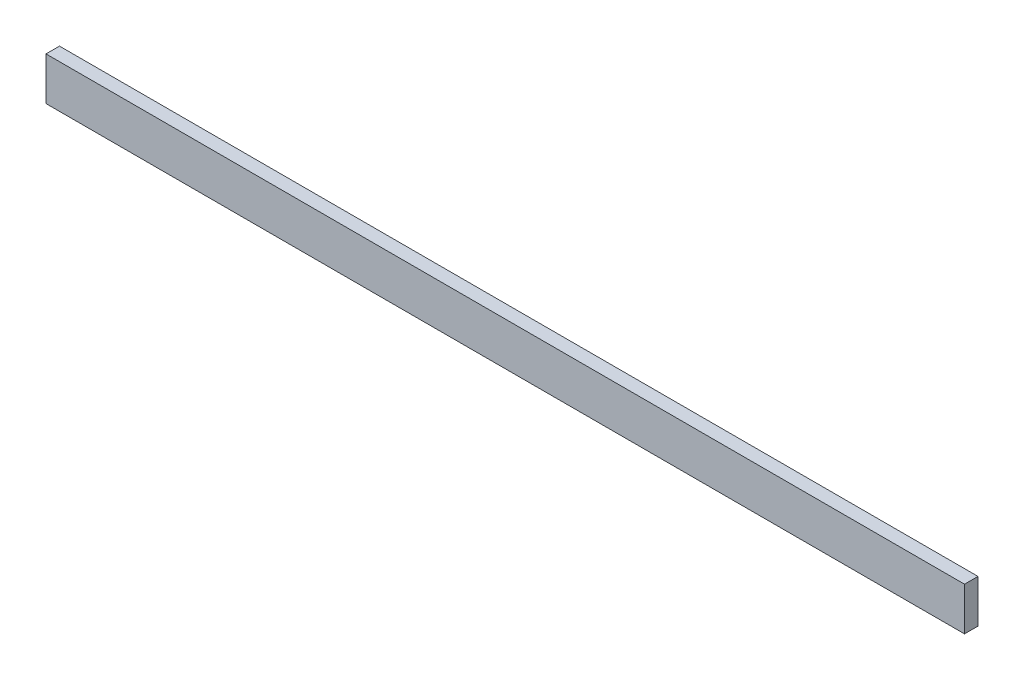
ISO-10303-21;
HEADER;
FILE_DESCRIPTION(('STEP AP214'),'2;1');
FILE_NAME('part.step','',(''),(''),'','','');
FILE_SCHEMA(('AUTOMOTIVE_DESIGN { 1 0 10303 214 1 1 1 1 }'));
ENDSEC;
DATA;
#1=APPLICATION_CONTEXT('core data for automotive mechanical design processes');
#2=APPLICATION_PROTOCOL_DEFINITION('international standard','automotive_design',2000,#1);
#3=PRODUCT_CONTEXT('',#1,'mechanical');
#4=PRODUCT('Part','Part','',(#3));
#5=PRODUCT_RELATED_PRODUCT_CATEGORY('part','',(#4));
#6=PRODUCT_DEFINITION_FORMATION('','',#4);
#7=PRODUCT_DEFINITION_CONTEXT('part definition',#1,'design');
#8=PRODUCT_DEFINITION('design','',#6,#7);
#9=PRODUCT_DEFINITION_SHAPE('','',#8);
#10=(LENGTH_UNIT() NAMED_UNIT(*) SI_UNIT(.MILLI.,.METRE.));
#11=(NAMED_UNIT(*) PLANE_ANGLE_UNIT() SI_UNIT($,.RADIAN.));
#12=(NAMED_UNIT(*) SI_UNIT($,.STERADIAN.) SOLID_ANGLE_UNIT());
#13=UNCERTAINTY_MEASURE_WITH_UNIT(LENGTH_MEASURE(1.E-05),#10,'distance_accuracy_value','');
#14=(GEOMETRIC_REPRESENTATION_CONTEXT(3) GLOBAL_UNCERTAINTY_ASSIGNED_CONTEXT((#13)) GLOBAL_UNIT_ASSIGNED_CONTEXT((#10,
#11,#12)) REPRESENTATION_CONTEXT('',''));
#15=CARTESIAN_POINT('',(0.,0.,0.));
#16=DIRECTION('',(0.,0.,1.));
#17=DIRECTION('',(1.,0.,0.));
#18=AXIS2_PLACEMENT_3D('',#15,#16,#17);
#19=CARTESIAN_POINT('',(3200.,-75.0000000000001,23.4999999999999));
#20=DIRECTION('',(0.,0.,-1.));
#21=DIRECTION('',(-1.,0.,0.));
#22=AXIS2_PLACEMENT_3D('',#19,#20,#21);
#23=PLANE('',#22);
#24=DIRECTION('',(0.,-1.,0.));
#25=VECTOR('',#24,1.);
#26=CARTESIAN_POINT('',(0.,-75.0000000000001,23.4999999999999));
#27=LINE('',#26,#25);
#28=CARTESIAN_POINT('',(0.,75.0000000000001,23.4999999999999));
#29=VERTEX_POINT('',#28);
#30=CARTESIAN_POINT('',(0.,-75.0000000000001,23.4999999999999));
#31=VERTEX_POINT('',#30);
#32=EDGE_CURVE('E96',#29,#31,#27,.T.);
#33=ORIENTED_EDGE('',*,*,#32,.T.);
#34=DIRECTION('',(-1.,0.,0.));
#35=VECTOR('',#34,1.);
#36=CARTESIAN_POINT('',(3200.,-75.0000000000001,23.4999999999999));
#37=LINE('',#36,#35);
#38=CARTESIAN_POINT('',(3200.,-75.0000000000001,23.4999999999999));
#39=VERTEX_POINT('',#38);
#40=EDGE_CURVE('E11',#39,#31,#37,.T.);
#41=ORIENTED_EDGE('',*,*,#40,.F.);
#42=DIRECTION('',(0.,-1.,0.));
#43=VECTOR('',#42,1.);
#44=CARTESIAN_POINT('',(3200.,-75.0000000000001,23.4999999999999));
#45=LINE('',#44,#43);
#46=CARTESIAN_POINT('',(3200.,75.0000000000001,23.4999999999999));
#47=VERTEX_POINT('',#46);
#48=EDGE_CURVE('E84',#47,#39,#45,.T.);
#49=ORIENTED_EDGE('',*,*,#48,.F.);
#50=DIRECTION('',(-1.,0.,0.));
#51=VECTOR('',#50,1.);
#52=CARTESIAN_POINT('',(3200.,75.0000000000001,23.4999999999999));
#53=LINE('',#52,#51);
#54=EDGE_CURVE('E92',#47,#29,#53,.T.);
#55=ORIENTED_EDGE('',*,*,#54,.T.);
#56=EDGE_LOOP('',(#33,#41,#49,#55));
#57=FACE_BOUND('',#56,.T.);
#58=ADVANCED_FACE('F33',(#57),#23,.F.);
#59=CARTESIAN_POINT('',(3200.,-75.0000000000001,-23.5000000000001));
#60=DIRECTION('',(0.,1.,0.));
#61=DIRECTION('',(0.,0.,1.));
#62=AXIS2_PLACEMENT_3D('',#59,#60,#61);
#63=PLANE('',#62);
#64=DIRECTION('',(0.,0.,-1.));
#65=VECTOR('',#64,1.);
#66=CARTESIAN_POINT('',(0.,-75.0000000000001,-23.5000000000001));
#67=LINE('',#66,#65);
#68=CARTESIAN_POINT('',(0.,-75.0000000000001,-23.5000000000001));
#69=VERTEX_POINT('',#68);
#70=EDGE_CURVE('E88',#31,#69,#67,.T.);
#71=ORIENTED_EDGE('',*,*,#70,.T.);
#72=DIRECTION('',(-1.,0.,0.));
#73=VECTOR('',#72,1.);
#74=CARTESIAN_POINT('',(3200.,-75.0000000000001,-23.5000000000001));
#75=LINE('',#74,#73);
#76=CARTESIAN_POINT('',(3200.,-75.0000000000001,-23.5000000000001));
#77=VERTEX_POINT('',#76);
#78=EDGE_CURVE('E41',#77,#69,#75,.T.);
#79=ORIENTED_EDGE('',*,*,#78,.F.);
#80=DIRECTION('',(0.,0.,-1.));
#81=VECTOR('',#80,1.);
#82=CARTESIAN_POINT('',(3200.,-75.0000000000001,-23.5000000000001));
#83=LINE('',#82,#81);
#84=EDGE_CURVE('E79',#39,#77,#83,.T.);
#85=ORIENTED_EDGE('',*,*,#84,.F.);
#86=ORIENTED_EDGE('',*,*,#40,.T.);
#87=EDGE_LOOP('',(#71,#79,#85,#86));
#88=FACE_BOUND('',#87,.T.);
#89=ADVANCED_FACE('F87',(#88),#63,.F.);
#90=CARTESIAN_POINT('',(3200.,-75.0000000000001,-23.5000000000001));
#91=DIRECTION('',(0.,0.,1.));
#92=DIRECTION('',(1.,0.,0.));
#93=AXIS2_PLACEMENT_3D('',#90,#91,#92);
#94=PLANE('',#93);
#95=DIRECTION('',(0.,1.,0.));
#96=VECTOR('',#95,1.);
#97=CARTESIAN_POINT('',(0.,-75.0000000000001,-23.5000000000001));
#98=LINE('',#97,#96);
#99=CARTESIAN_POINT('',(0.,75.0000000000001,-23.5000000000001));
#100=VERTEX_POINT('',#99);
#101=EDGE_CURVE('E66',#69,#100,#98,.T.);
#102=ORIENTED_EDGE('',*,*,#101,.T.);
#103=DIRECTION('',(-1.,0.,0.));
#104=VECTOR('',#103,1.);
#105=CARTESIAN_POINT('',(3200.,75.0000000000001,-23.5000000000001));
#106=LINE('',#105,#104);
#107=CARTESIAN_POINT('',(3200.,75.0000000000001,-23.5000000000001));
#108=VERTEX_POINT('',#107);
#109=EDGE_CURVE('E89',#108,#100,#106,.T.);
#110=ORIENTED_EDGE('',*,*,#109,.F.);
#111=DIRECTION('',(0.,1.,0.));
#112=VECTOR('',#111,1.);
#113=CARTESIAN_POINT('',(3200.,-75.0000000000001,-23.5000000000001));
#114=LINE('',#113,#112);
#115=EDGE_CURVE('E82',#77,#108,#114,.T.);
#116=ORIENTED_EDGE('',*,*,#115,.F.);
#117=ORIENTED_EDGE('',*,*,#78,.T.);
#118=EDGE_LOOP('',(#102,#110,#116,#117));
#119=FACE_BOUND('',#118,.T.);
#120=ADVANCED_FACE('F90',(#119),#94,.F.);
#121=CARTESIAN_POINT('',(3200.,75.0000000000001,-23.5000000000001));
#122=DIRECTION('',(0.,-1.,0.));
#123=DIRECTION('',(0.,0.,-1.));
#124=AXIS2_PLACEMENT_3D('',#121,#122,#123);
#125=PLANE('',#124);
#126=DIRECTION('',(0.,0.,1.));
#127=VECTOR('',#126,1.);
#128=CARTESIAN_POINT('',(0.,75.0000000000001,-23.5000000000001));
#129=LINE('',#128,#127);
#130=EDGE_CURVE('E72',#100,#29,#129,.T.);
#131=ORIENTED_EDGE('',*,*,#130,.T.);
#132=ORIENTED_EDGE('',*,*,#54,.F.);
#133=DIRECTION('',(0.,0.,1.));
#134=VECTOR('',#133,1.);
#135=CARTESIAN_POINT('',(3200.,75.0000000000001,-23.5000000000001));
#136=LINE('',#135,#134);
#137=EDGE_CURVE('E49',#108,#47,#136,.T.);
#138=ORIENTED_EDGE('',*,*,#137,.F.);
#139=ORIENTED_EDGE('',*,*,#109,.T.);
#140=EDGE_LOOP('',(#131,#132,#138,#139));
#141=FACE_BOUND('',#140,.T.);
#142=ADVANCED_FACE('F103',(#141),#125,.F.);
#143=CARTESIAN_POINT('',(3200.,0.,0.));
#144=DIRECTION('',(1.,0.,0.));
#145=DIRECTION('',(0.,0.,-1.));
#146=AXIS2_PLACEMENT_3D('',#143,#144,#145);
#147=PLANE('',#146);
#148=ORIENTED_EDGE('',*,*,#48,.T.);
#149=ORIENTED_EDGE('',*,*,#84,.T.);
#150=ORIENTED_EDGE('',*,*,#115,.T.);
#151=ORIENTED_EDGE('',*,*,#137,.T.);
#152=EDGE_LOOP('',(#148,#149,#150,#151));
#153=FACE_BOUND('',#152,.T.);
#154=ADVANCED_FACE('F80',(#153),#147,.T.);
#155=CARTESIAN_POINT('',(0.,0.,0.));
#156=DIRECTION('',(1.,0.,0.));
#157=DIRECTION('',(0.,0.,-1.));
#158=AXIS2_PLACEMENT_3D('',#155,#156,#157);
#159=PLANE('',#158);
#160=ORIENTED_EDGE('',*,*,#32,.F.);
#161=ORIENTED_EDGE('',*,*,#130,.F.);
#162=ORIENTED_EDGE('',*,*,#101,.F.);
#163=ORIENTED_EDGE('',*,*,#70,.F.);
#164=EDGE_LOOP('',(#160,#161,#162,#163));
#165=FACE_BOUND('',#164,.T.);
#166=ADVANCED_FACE('F106',(#165),#159,.F.);
#167=CLOSED_SHELL('',(#58,#89,#120,#142,#154,#166));
#168=MANIFOLD_SOLID_BREP('B2',#167);
#169=ADVANCED_BREP_SHAPE_REPRESENTATION('',(#18,#168),#14);
#170=SHAPE_DEFINITION_REPRESENTATION(#9,#169);
ENDSEC;
END-ISO-10303-21;
